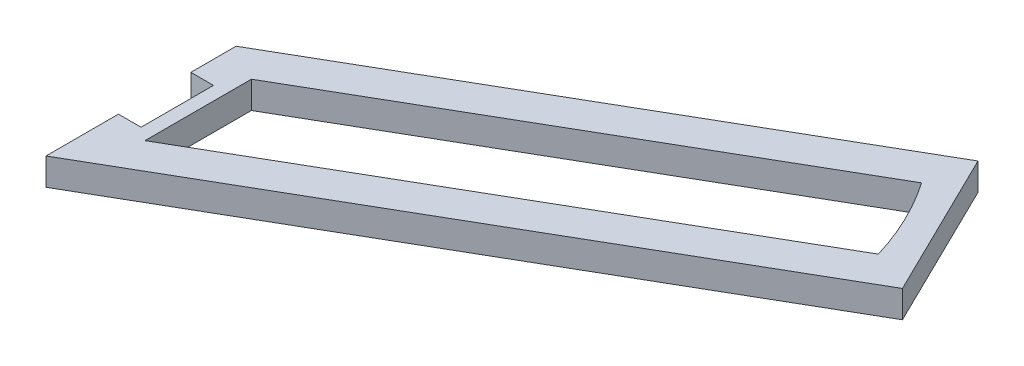
ISO-10303-21;
HEADER;
FILE_DESCRIPTION(('STEP AP214'),'2;1');
FILE_NAME('part.step','',(''),(''),'','','');
FILE_SCHEMA(('AUTOMOTIVE_DESIGN { 1 0 10303 214 1 1 1 1 }'));
ENDSEC;
DATA;
#1=APPLICATION_CONTEXT('core data for automotive mechanical design processes');
#2=APPLICATION_PROTOCOL_DEFINITION('international standard','automotive_design',2000,#1);
#3=PRODUCT_CONTEXT('',#1,'mechanical');
#4=PRODUCT('Part','Part','',(#3));
#5=PRODUCT_RELATED_PRODUCT_CATEGORY('part','',(#4));
#6=PRODUCT_DEFINITION_FORMATION('','',#4);
#7=PRODUCT_DEFINITION_CONTEXT('part definition',#1,'design');
#8=PRODUCT_DEFINITION('design','',#6,#7);
#9=PRODUCT_DEFINITION_SHAPE('','',#8);
#10=(LENGTH_UNIT() NAMED_UNIT(*) SI_UNIT(.MILLI.,.METRE.));
#11=(NAMED_UNIT(*) PLANE_ANGLE_UNIT() SI_UNIT($,.RADIAN.));
#12=(NAMED_UNIT(*) SI_UNIT($,.STERADIAN.) SOLID_ANGLE_UNIT());
#13=UNCERTAINTY_MEASURE_WITH_UNIT(LENGTH_MEASURE(1.E-05),#10,'distance_accuracy_value','');
#14=(GEOMETRIC_REPRESENTATION_CONTEXT(3) GLOBAL_UNCERTAINTY_ASSIGNED_CONTEXT((#13)) GLOBAL_UNIT_ASSIGNED_CONTEXT((#10,
#11,#12)) REPRESENTATION_CONTEXT('',''));
#15=CARTESIAN_POINT('',(0.,0.,0.));
#16=DIRECTION('',(0.,0.,1.));
#17=DIRECTION('',(1.,0.,0.));
#18=AXIS2_PLACEMENT_3D('',#15,#16,#17);
#19=CARTESIAN_POINT('',(0.,3.,0.));
#20=DIRECTION('',(1.,0.,0.));
#21=DIRECTION('',(0.,0.,-1.));
#22=AXIS2_PLACEMENT_3D('',#19,#20,#21);
#23=PLANE('',#22);
#24=DIRECTION('',(0.,0.,1.));
#25=VECTOR('',#24,1.);
#26=CARTESIAN_POINT('',(0.,0.,0.));
#27=LINE('',#26,#25);
#28=CARTESIAN_POINT('',(0.,0.,0.));
#29=VERTEX_POINT('',#28);
#30=CARTESIAN_POINT('',(0.,0.,5.));
#31=VERTEX_POINT('',#30);
#32=EDGE_CURVE('E189',#29,#31,#27,.T.);
#33=ORIENTED_EDGE('',*,*,#32,.T.);
#34=DIRECTION('',(0.,1.,0.));
#35=VECTOR('',#34,1.);
#36=CARTESIAN_POINT('',(0.,-7.,5.));
#37=LINE('',#36,#35);
#38=CARTESIAN_POINT('',(0.,3.,5.));
#39=VERTEX_POINT('',#38);
#40=EDGE_CURVE('E153',#31,#39,#37,.T.);
#41=ORIENTED_EDGE('',*,*,#40,.T.);
#42=DIRECTION('',(0.,0.,1.));
#43=VECTOR('',#42,1.);
#44=CARTESIAN_POINT('',(0.,3.,0.));
#45=LINE('',#44,#43);
#46=CARTESIAN_POINT('',(0.,3.,0.));
#47=VERTEX_POINT('',#46);
#48=EDGE_CURVE('E170',#47,#39,#45,.T.);
#49=ORIENTED_EDGE('',*,*,#48,.F.);
#50=DIRECTION('',(0.,-1.,0.));
#51=VECTOR('',#50,1.);
#52=CARTESIAN_POINT('',(0.,3.,0.));
#53=LINE('',#52,#51);
#54=EDGE_CURVE('E218',#47,#29,#53,.T.);
#55=ORIENTED_EDGE('',*,*,#54,.T.);
#56=EDGE_LOOP('',(#33,#41,#49,#55));
#57=FACE_BOUND('',#56,.T.);
#58=ADVANCED_FACE('F39',(#57),#23,.F.);
#59=CARTESIAN_POINT('',(51.9615242270663,-0.01,-30.0000000000001));
#60=DIRECTION('',(-0.897939701167475,0.,0.440118498892361));
#61=DIRECTION('',(0.440118498892361,0.,0.897939701167475));
#62=AXIS2_PLACEMENT_3D('',#59,#60,#61);
#63=PLANE('',#62);
#64=DIRECTION('',(0.,-1.,0.));
#65=VECTOR('',#64,1.);
#66=CARTESIAN_POINT('',(51.9615242270663,3.,-30.0000000000001));
#67=LINE('',#66,#65);
#68=CARTESIAN_POINT('',(51.9615242270663,3.,-30.0000000000001));
#69=VERTEX_POINT('',#68);
#70=CARTESIAN_POINT('',(51.9615242270663,0.,-30.0000000000001));
#71=VERTEX_POINT('',#70);
#72=EDGE_CURVE('E209',#69,#71,#67,.T.);
#73=ORIENTED_EDGE('',*,*,#72,.F.);
#74=DIRECTION('',(0.440118498892361,0.,0.897939701167475));
#75=VECTOR('',#74,1.);
#76=CARTESIAN_POINT('',(53.7523501111754,3.,-26.3463165868582));
#77=LINE('',#76,#75);
#78=CARTESIAN_POINT('',(59.9842235657876,3.,-13.6319076228383));
#79=VERTEX_POINT('',#78);
#80=EDGE_CURVE('E43',#69,#79,#77,.T.);
#81=ORIENTED_EDGE('',*,*,#80,.T.);
#82=DIRECTION('',(0.,-1.,0.));
#83=VECTOR('',#82,1.);
#84=CARTESIAN_POINT('',(59.9842235657876,3.,-13.6319076228383));
#85=LINE('',#84,#83);
#86=CARTESIAN_POINT('',(59.9842235657876,0.,-13.6319076228383));
#87=VERTEX_POINT('',#86);
#88=EDGE_CURVE('E11',#79,#87,#85,.T.);
#89=ORIENTED_EDGE('',*,*,#88,.T.);
#90=DIRECTION('',(0.440118498892361,0.,0.897939701167475));
#91=VECTOR('',#90,1.);
#92=CARTESIAN_POINT('',(53.7523501111754,0.,-26.3463165868582));
#93=LINE('',#92,#91);
#94=EDGE_CURVE('E63',#71,#87,#93,.T.);
#95=ORIENTED_EDGE('',*,*,#94,.F.);
#96=EDGE_LOOP('',(#73,#81,#89,#95));
#97=FACE_BOUND('',#96,.T.);
#98=ADVANCED_FACE('F41',(#97),#63,.F.);
#99=CARTESIAN_POINT('',(24.1064272107357,3.,-6.19685081140149));
#100=DIRECTION('',(0.,-1.,0.));
#101=DIRECTION('',(0.,0.,-1.));
#102=AXIS2_PLACEMENT_3D('',#99,#100,#101);
#103=CYLINDRICAL_SURFACE('',#102,32.6400919906578);
#104=CARTESIAN_POINT('',(24.1064272107357,0.,-6.19685081140149));
#105=DIRECTION('',(0.,1.,0.));
#106=DIRECTION('',(0.,0.,1.));
#107=AXIS2_PLACEMENT_3D('',#104,#105,#106);
#108=CIRCLE('',#107,32.6400919906578);
#109=CARTESIAN_POINT('',(50.9343691856006,0.,-24.7881696067934));
#110=VERTEX_POINT('',#109);
#111=CARTESIAN_POINT('',(55.3672140489402,0.,-15.5850780889523));
#112=VERTEX_POINT('',#111);
#113=EDGE_CURVE('E198',#110,#112,#108,.F.);
#114=ORIENTED_EDGE('',*,*,#113,.T.);
#115=DIRECTION('',(0.,-1.,0.));
#116=VECTOR('',#115,1.);
#117=CARTESIAN_POINT('',(55.3672140489402,3.,-15.5850780889523));
#118=LINE('',#117,#116);
#119=CARTESIAN_POINT('',(55.3672140489402,3.,-15.5850780889523));
#120=VERTEX_POINT('',#119);
#121=EDGE_CURVE('E211',#120,#112,#118,.T.);
#122=ORIENTED_EDGE('',*,*,#121,.F.);
#123=CARTESIAN_POINT('',(24.1064272107357,3.,-6.19685081140149));
#124=DIRECTION('',(0.,1.,0.));
#125=DIRECTION('',(0.,0.,1.));
#126=AXIS2_PLACEMENT_3D('',#123,#124,#125);
#127=CIRCLE('',#126,32.6400919906578);
#128=CARTESIAN_POINT('',(50.9343691856006,3.,-24.7881696067934));
#129=VERTEX_POINT('',#128);
#130=EDGE_CURVE('E178',#129,#120,#127,.F.);
#131=ORIENTED_EDGE('',*,*,#130,.F.);
#132=DIRECTION('',(0.,-1.,0.));
#133=VECTOR('',#132,1.);
#134=CARTESIAN_POINT('',(50.9343691856006,3.,-24.7881696067934));
#135=LINE('',#134,#133);
#136=EDGE_CURVE('E213',#129,#110,#135,.T.);
#137=ORIENTED_EDGE('',*,*,#136,.T.);
#138=EDGE_LOOP('',(#114,#122,#131,#137));
#139=FACE_BOUND('',#138,.T.);
#140=ADVANCED_FACE('F251',(#139),#103,.F.);
#141=CARTESIAN_POINT('',(7.09326673973661,3.,12.2858983848622));
#142=DIRECTION('',(-0.500000000000001,0.,-0.866025403784438));
#143=DIRECTION('',(-0.866025403784438,0.,0.500000000000001));
#144=AXIS2_PLACEMENT_3D('',#141,#142,#143);
#145=PLANE('',#144);
#146=DIRECTION('',(0.866025403784438,0.,-0.500000000000001));
#147=VECTOR('',#146,1.);
#148=CARTESIAN_POINT('',(7.09326673973661,0.,12.2858983848622));
#149=LINE('',#148,#147);
#150=CARTESIAN_POINT('',(4.,0.,14.0717967697245));
#151=VERTEX_POINT('',#150);
#152=EDGE_CURVE('E201',#151,#112,#149,.T.);
#153=ORIENTED_EDGE('',*,*,#152,.F.);
#154=DIRECTION('',(0.,-1.,0.));
#155=VECTOR('',#154,1.);
#156=CARTESIAN_POINT('',(4.,3.,14.0717967697245));
#157=LINE('',#156,#155);
#158=CARTESIAN_POINT('',(4.,3.,14.0717967697245));
#159=VERTEX_POINT('',#158);
#160=EDGE_CURVE('E208',#159,#151,#157,.T.);
#161=ORIENTED_EDGE('',*,*,#160,.F.);
#162=DIRECTION('',(0.866025403784438,0.,-0.500000000000001));
#163=VECTOR('',#162,1.);
#164=CARTESIAN_POINT('',(7.09326673973661,3.,12.2858983848622));
#165=LINE('',#164,#163);
#166=EDGE_CURVE('E180',#159,#120,#165,.T.);
#167=ORIENTED_EDGE('',*,*,#166,.T.);
#168=ORIENTED_EDGE('',*,*,#121,.T.);
#169=EDGE_LOOP('',(#153,#161,#167,#168));
#170=FACE_BOUND('',#169,.T.);
#171=ADVANCED_FACE('F248',(#170),#145,.T.);
#172=CARTESIAN_POINT('',(4.,3.,0.));
#173=DIRECTION('',(1.,0.,0.));
#174=DIRECTION('',(0.,0.,-1.));
#175=AXIS2_PLACEMENT_3D('',#172,#173,#174);
#176=PLANE('',#175);
#177=DIRECTION('',(0.,0.,1.));
#178=VECTOR('',#177,1.);
#179=CARTESIAN_POINT('',(4.,0.,0.));
#180=LINE('',#179,#178);
#181=CARTESIAN_POINT('',(4.,0.,2.3094010767585));
#182=VERTEX_POINT('',#181);
#183=EDGE_CURVE('E169',#182,#151,#180,.T.);
#184=ORIENTED_EDGE('',*,*,#183,.F.);
#185=DIRECTION('',(0.,-1.,0.));
#186=VECTOR('',#185,1.);
#187=CARTESIAN_POINT('',(4.,3.,2.3094010767585));
#188=LINE('',#187,#186);
#189=CARTESIAN_POINT('',(4.,3.,2.3094010767585));
#190=VERTEX_POINT('',#189);
#191=EDGE_CURVE('E206',#190,#182,#188,.T.);
#192=ORIENTED_EDGE('',*,*,#191,.F.);
#193=DIRECTION('',(0.,0.,1.));
#194=VECTOR('',#193,1.);
#195=CARTESIAN_POINT('',(4.,3.,0.));
#196=LINE('',#195,#194);
#197=EDGE_CURVE('E183',#190,#159,#196,.T.);
#198=ORIENTED_EDGE('',*,*,#197,.T.);
#199=ORIENTED_EDGE('',*,*,#160,.T.);
#200=EDGE_LOOP('',(#184,#192,#198,#199));
#201=FACE_BOUND('',#200,.T.);
#202=ADVANCED_FACE('F242',(#201),#176,.T.);
#203=CARTESIAN_POINT('',(2.00000000000001,3.,3.46410161513775));
#204=DIRECTION('',(-0.500000000000001,0.,-0.866025403784438));
#205=DIRECTION('',(-0.866025403784438,0.,0.500000000000001));
#206=AXIS2_PLACEMENT_3D('',#203,#204,#205);
#207=PLANE('',#206);
#208=DIRECTION('',(0.866025403784438,0.,-0.500000000000001));
#209=VECTOR('',#208,1.);
#210=CARTESIAN_POINT('',(2.00000000000001,0.,3.46410161513775));
#211=LINE('',#210,#209);
#212=EDGE_CURVE('E195',#182,#110,#211,.T.);
#213=ORIENTED_EDGE('',*,*,#212,.T.);
#214=ORIENTED_EDGE('',*,*,#136,.F.);
#215=DIRECTION('',(0.866025403784438,0.,-0.500000000000001));
#216=VECTOR('',#215,1.);
#217=CARTESIAN_POINT('',(2.00000000000001,3.,3.46410161513775));
#218=LINE('',#217,#216);
#219=EDGE_CURVE('E175',#190,#129,#218,.T.);
#220=ORIENTED_EDGE('',*,*,#219,.F.);
#221=ORIENTED_EDGE('',*,*,#191,.T.);
#222=EDGE_LOOP('',(#213,#214,#220,#221));
#223=FACE_BOUND('',#222,.T.);
#224=ADVANCED_FACE('F252',(#223),#207,.F.);
#225=CARTESIAN_POINT('',(0.,3.,13.));
#226=VERTEX_POINT('',#225);
#227=CARTESIAN_POINT('',(0.,3.,21.));
#228=VERTEX_POINT('',#227);
#229=EDGE_CURVE('E168',#226,#228,#45,.T.);
#230=ORIENTED_EDGE('',*,*,#229,.F.);
#231=DIRECTION('',(0.,1.,0.));
#232=VECTOR('',#231,1.);
#233=CARTESIAN_POINT('',(0.,-7.,13.));
#234=LINE('',#233,#232);
#235=CARTESIAN_POINT('',(0.,0.,13.));
#236=VERTEX_POINT('',#235);
#237=EDGE_CURVE('E55',#236,#226,#234,.T.);
#238=ORIENTED_EDGE('',*,*,#237,.F.);
#239=CARTESIAN_POINT('',(0.,0.,21.));
#240=VERTEX_POINT('',#239);
#241=EDGE_CURVE('E188',#236,#240,#27,.T.);
#242=ORIENTED_EDGE('',*,*,#241,.T.);
#243=DIRECTION('',(0.,-1.,0.));
#244=VECTOR('',#243,1.);
#245=CARTESIAN_POINT('',(0.,3.,21.));
#246=LINE('',#245,#244);
#247=EDGE_CURVE('E186',#228,#240,#246,.T.);
#248=ORIENTED_EDGE('',*,*,#247,.F.);
#249=EDGE_LOOP('',(#230,#238,#242,#248));
#250=FACE_BOUND('',#249,.T.);
#251=ADVANCED_FACE('F230',(#250),#23,.F.);
#252=CARTESIAN_POINT('',(9.09326673973662,3.,15.75));
#253=DIRECTION('',(-0.500000000000001,0.,-0.866025403784438));
#254=DIRECTION('',(-0.866025403784438,0.,0.500000000000001));
#255=AXIS2_PLACEMENT_3D('',#252,#253,#254);
#256=PLANE('',#255);
#257=DIRECTION('',(0.866025403784438,0.,-0.500000000000001));
#258=VECTOR('',#257,1.);
#259=CARTESIAN_POINT('',(9.09326673973662,0.,15.75));
#260=LINE('',#259,#258);
#261=EDGE_CURVE('E192',#240,#87,#260,.T.);
#262=ORIENTED_EDGE('',*,*,#261,.T.);
#263=ORIENTED_EDGE('',*,*,#88,.F.);
#264=DIRECTION('',(0.866025403784438,0.,-0.500000000000001));
#265=VECTOR('',#264,1.);
#266=CARTESIAN_POINT('',(9.09326673973662,3.,15.75));
#267=LINE('',#266,#265);
#268=EDGE_CURVE('E172',#228,#79,#267,.T.);
#269=ORIENTED_EDGE('',*,*,#268,.F.);
#270=ORIENTED_EDGE('',*,*,#247,.T.);
#271=EDGE_LOOP('',(#262,#263,#269,#270));
#272=FACE_BOUND('',#271,.T.);
#273=ADVANCED_FACE('F228',(#272),#256,.F.);
#274=CARTESIAN_POINT('',(0.,3.,0.));
#275=DIRECTION('',(-0.500000000000001,0.,-0.866025403784438));
#276=DIRECTION('',(-0.866025403784438,0.,0.500000000000001));
#277=AXIS2_PLACEMENT_3D('',#274,#275,#276);
#278=PLANE('',#277);
#279=DIRECTION('',(0.866025403784438,0.,-0.500000000000001));
#280=VECTOR('',#279,1.);
#281=CARTESIAN_POINT('',(0.,0.,0.));
#282=LINE('',#281,#280);
#283=EDGE_CURVE('E164',#29,#71,#282,.T.);
#284=ORIENTED_EDGE('',*,*,#283,.F.);
#285=ORIENTED_EDGE('',*,*,#54,.F.);
#286=DIRECTION('',(0.866025403784438,0.,-0.500000000000001));
#287=VECTOR('',#286,1.);
#288=CARTESIAN_POINT('',(0.,3.,0.));
#289=LINE('',#288,#287);
#290=EDGE_CURVE('E165',#47,#69,#289,.T.);
#291=ORIENTED_EDGE('',*,*,#290,.T.);
#292=ORIENTED_EDGE('',*,*,#72,.T.);
#293=EDGE_LOOP('',(#284,#285,#291,#292));
#294=FACE_BOUND('',#293,.T.);
#295=ADVANCED_FACE('F235',(#294),#278,.T.);
#296=CARTESIAN_POINT('',(0.,0.,0.));
#297=DIRECTION('',(0.,1.,0.));
#298=DIRECTION('',(0.,0.,1.));
#299=AXIS2_PLACEMENT_3D('',#296,#297,#298);
#300=PLANE('',#299);
#301=DIRECTION('',(0.,0.,-1.));
#302=VECTOR('',#301,1.);
#303=CARTESIAN_POINT('',(2.5,0.,0.));
#304=LINE('',#303,#302);
#305=CARTESIAN_POINT('',(2.5,0.,13.));
#306=VERTEX_POINT('',#305);
#307=CARTESIAN_POINT('',(2.5,0.,5.));
#308=VERTEX_POINT('',#307);
#309=EDGE_CURVE('E137',#306,#308,#304,.T.);
#310=ORIENTED_EDGE('',*,*,#309,.T.);
#311=DIRECTION('',(-1.,0.,0.));
#312=VECTOR('',#311,1.);
#313=CARTESIAN_POINT('',(0.,0.,5.));
#314=LINE('',#313,#312);
#315=EDGE_CURVE('E161',#308,#31,#314,.T.);
#316=ORIENTED_EDGE('',*,*,#315,.T.);
#317=ORIENTED_EDGE('',*,*,#32,.F.);
#318=ORIENTED_EDGE('',*,*,#283,.T.);
#319=ORIENTED_EDGE('',*,*,#94,.T.);
#320=ORIENTED_EDGE('',*,*,#261,.F.);
#321=ORIENTED_EDGE('',*,*,#241,.F.);
#322=DIRECTION('',(1.,0.,0.));
#323=VECTOR('',#322,1.);
#324=CARTESIAN_POINT('',(0.,0.,13.));
#325=LINE('',#324,#323);
#326=EDGE_CURVE('E156',#236,#306,#325,.T.);
#327=ORIENTED_EDGE('',*,*,#326,.T.);
#328=EDGE_LOOP('',(#310,#316,#317,#318,#319,#320,#321,#327));
#329=FACE_BOUND('',#328,.T.);
#330=ORIENTED_EDGE('',*,*,#212,.F.);
#331=ORIENTED_EDGE('',*,*,#183,.T.);
#332=ORIENTED_EDGE('',*,*,#152,.T.);
#333=ORIENTED_EDGE('',*,*,#113,.F.);
#334=EDGE_LOOP('',(#330,#331,#332,#333));
#335=FACE_BOUND('',#334,.T.);
#336=ADVANCED_FACE('F232',(#329,#335),#300,.F.);
#337=CARTESIAN_POINT('',(0.,3.,0.));
#338=DIRECTION('',(0.,1.,0.));
#339=DIRECTION('',(0.,0.,1.));
#340=AXIS2_PLACEMENT_3D('',#337,#338,#339);
#341=PLANE('',#340);
#342=DIRECTION('',(-1.,0.,0.));
#343=VECTOR('',#342,1.);
#344=CARTESIAN_POINT('',(0.,3.,5.));
#345=LINE('',#344,#343);
#346=CARTESIAN_POINT('',(2.5,3.,5.));
#347=VERTEX_POINT('',#346);
#348=EDGE_CURVE('E149',#347,#39,#345,.T.);
#349=ORIENTED_EDGE('',*,*,#348,.F.);
#350=DIRECTION('',(0.,0.,-1.));
#351=VECTOR('',#350,1.);
#352=CARTESIAN_POINT('',(2.5,3.,5.));
#353=LINE('',#352,#351);
#354=CARTESIAN_POINT('',(2.5,3.,13.));
#355=VERTEX_POINT('',#354);
#356=EDGE_CURVE('E134',#355,#347,#353,.T.);
#357=ORIENTED_EDGE('',*,*,#356,.F.);
#358=DIRECTION('',(1.,0.,0.));
#359=VECTOR('',#358,1.);
#360=CARTESIAN_POINT('',(2.5,3.,13.));
#361=LINE('',#360,#359);
#362=EDGE_CURVE('E141',#226,#355,#361,.T.);
#363=ORIENTED_EDGE('',*,*,#362,.F.);
#364=ORIENTED_EDGE('',*,*,#229,.T.);
#365=ORIENTED_EDGE('',*,*,#268,.T.);
#366=ORIENTED_EDGE('',*,*,#80,.F.);
#367=ORIENTED_EDGE('',*,*,#290,.F.);
#368=ORIENTED_EDGE('',*,*,#48,.T.);
#369=EDGE_LOOP('',(#349,#357,#363,#364,#365,#366,#367,#368));
#370=FACE_BOUND('',#369,.T.);
#371=ORIENTED_EDGE('',*,*,#219,.T.);
#372=ORIENTED_EDGE('',*,*,#130,.T.);
#373=ORIENTED_EDGE('',*,*,#166,.F.);
#374=ORIENTED_EDGE('',*,*,#197,.F.);
#375=EDGE_LOOP('',(#371,#372,#373,#374));
#376=FACE_BOUND('',#375,.T.);
#377=ADVANCED_FACE('F146',(#370,#376),#341,.T.);
#378=CARTESIAN_POINT('',(0.,-7.,5.));
#379=DIRECTION('',(0.,0.,-1.));
#380=DIRECTION('',(-1.,0.,0.));
#381=AXIS2_PLACEMENT_3D('',#378,#379,#380);
#382=PLANE('',#381);
#383=DIRECTION('',(0.,1.,0.));
#384=VECTOR('',#383,1.);
#385=CARTESIAN_POINT('',(2.5,-7.,5.));
#386=LINE('',#385,#384);
#387=EDGE_CURVE('E139',#308,#347,#386,.T.);
#388=ORIENTED_EDGE('',*,*,#387,.T.);
#389=ORIENTED_EDGE('',*,*,#348,.T.);
#390=ORIENTED_EDGE('',*,*,#40,.F.);
#391=ORIENTED_EDGE('',*,*,#315,.F.);
#392=EDGE_LOOP('',(#388,#389,#390,#391));
#393=FACE_BOUND('',#392,.T.);
#394=ADVANCED_FACE('F254',(#393),#382,.F.);
#395=CARTESIAN_POINT('',(2.5,-7.,5.));
#396=DIRECTION('',(1.,0.,0.));
#397=DIRECTION('',(0.,0.,-1.));
#398=AXIS2_PLACEMENT_3D('',#395,#396,#397);
#399=PLANE('',#398);
#400=DIRECTION('',(0.,1.,0.));
#401=VECTOR('',#400,1.);
#402=CARTESIAN_POINT('',(2.5,-7.,13.));
#403=LINE('',#402,#401);
#404=EDGE_CURVE('E130',#306,#355,#403,.T.);
#405=ORIENTED_EDGE('',*,*,#404,.T.);
#406=ORIENTED_EDGE('',*,*,#356,.T.);
#407=ORIENTED_EDGE('',*,*,#387,.F.);
#408=ORIENTED_EDGE('',*,*,#309,.F.);
#409=EDGE_LOOP('',(#405,#406,#407,#408));
#410=FACE_BOUND('',#409,.T.);
#411=ADVANCED_FACE('F131',(#410),#399,.F.);
#412=CARTESIAN_POINT('',(2.5,-7.,13.));
#413=DIRECTION('',(0.,0.,1.));
#414=DIRECTION('',(1.,0.,0.));
#415=AXIS2_PLACEMENT_3D('',#412,#413,#414);
#416=PLANE('',#415);
#417=ORIENTED_EDGE('',*,*,#237,.T.);
#418=ORIENTED_EDGE('',*,*,#362,.T.);
#419=ORIENTED_EDGE('',*,*,#404,.F.);
#420=ORIENTED_EDGE('',*,*,#326,.F.);
#421=EDGE_LOOP('',(#417,#418,#419,#420));
#422=FACE_BOUND('',#421,.T.);
#423=ADVANCED_FACE('F142',(#422),#416,.F.);
#424=CLOSED_SHELL('',(#58,#98,#140,#171,#202,#224,#251,#273,#295,#336,#377,#394,#411,#423));
#425=MANIFOLD_SOLID_BREP('B2',#424);
#426=ADVANCED_BREP_SHAPE_REPRESENTATION('',(#18,#425),#14);
#427=SHAPE_DEFINITION_REPRESENTATION(#9,#426);
ENDSEC;
END-ISO-10303-21;
